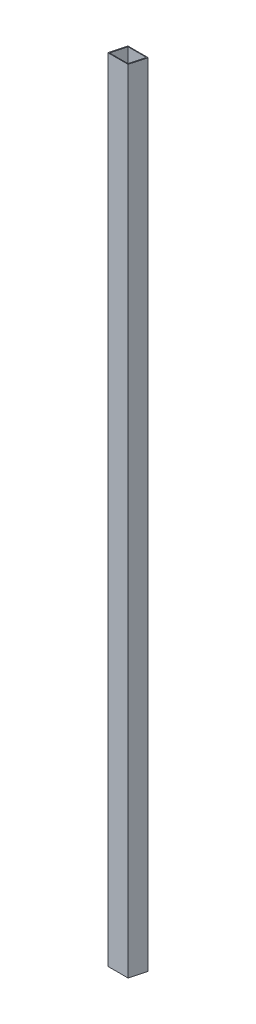
ISO-10303-21;
HEADER;
FILE_DESCRIPTION(('STEP AP214'),'2;1');
FILE_NAME('part.step','',(''),(''),'','','');
FILE_SCHEMA(('AUTOMOTIVE_DESIGN { 1 0 10303 214 1 1 1 1 }'));
ENDSEC;
DATA;
#1=APPLICATION_CONTEXT('core data for automotive mechanical design processes');
#2=APPLICATION_PROTOCOL_DEFINITION('international standard','automotive_design',2000,#1);
#3=PRODUCT_CONTEXT('',#1,'mechanical');
#4=PRODUCT('Part','Part','',(#3));
#5=PRODUCT_RELATED_PRODUCT_CATEGORY('part','',(#4));
#6=PRODUCT_DEFINITION_FORMATION('','',#4);
#7=PRODUCT_DEFINITION_CONTEXT('part definition',#1,'design');
#8=PRODUCT_DEFINITION('design','',#6,#7);
#9=PRODUCT_DEFINITION_SHAPE('','',#8);
#10=(LENGTH_UNIT() NAMED_UNIT(*) SI_UNIT(.MILLI.,.METRE.));
#11=(NAMED_UNIT(*) PLANE_ANGLE_UNIT() SI_UNIT($,.RADIAN.));
#12=(NAMED_UNIT(*) SI_UNIT($,.STERADIAN.) SOLID_ANGLE_UNIT());
#13=UNCERTAINTY_MEASURE_WITH_UNIT(LENGTH_MEASURE(1.E-05),#10,'distance_accuracy_value','');
#14=(GEOMETRIC_REPRESENTATION_CONTEXT(3) GLOBAL_UNCERTAINTY_ASSIGNED_CONTEXT((#13)) GLOBAL_UNIT_ASSIGNED_CONTEXT((#10,
#11,#12)) REPRESENTATION_CONTEXT('',''));
#15=CARTESIAN_POINT('',(0.,0.,0.));
#16=DIRECTION('',(0.,0.,1.));
#17=DIRECTION('',(1.,0.,0.));
#18=AXIS2_PLACEMENT_3D('',#15,#16,#17);
#19=CARTESIAN_POINT('',(-11.5,1200.,-11.5));
#20=DIRECTION('',(0.,0.,1.));
#21=DIRECTION('',(1.,0.,0.));
#22=AXIS2_PLACEMENT_3D('',#19,#20,#21);
#23=PLANE('',#22);
#24=DIRECTION('',(-1.,0.,0.));
#25=VECTOR('',#24,1.);
#26=CARTESIAN_POINT('',(-11.5,0.212556561669963,-11.5));
#27=LINE('',#26,#25);
#28=CARTESIAN_POINT('',(11.5,0.212556561669963,-11.5));
#29=VERTEX_POINT('',#28);
#30=CARTESIAN_POINT('',(-11.5,0.212556561669963,-11.5));
#31=VERTEX_POINT('',#30);
#32=EDGE_CURVE('E11',#29,#31,#27,.T.);
#33=ORIENTED_EDGE('',*,*,#32,.F.);
#34=DIRECTION('',(0.,-1.,0.));
#35=VECTOR('',#34,1.);
#36=CARTESIAN_POINT('',(11.5,1200.,-11.5));
#37=LINE('',#36,#35);
#38=CARTESIAN_POINT('',(11.5,981.659527632097,-11.5));
#39=VERTEX_POINT('',#38);
#40=EDGE_CURVE('E150',#39,#29,#37,.T.);
#41=ORIENTED_EDGE('',*,*,#40,.F.);
#42=DIRECTION('',(1.,0.,0.));
#43=VECTOR('',#42,1.);
#44=CARTESIAN_POINT('',(-11.5,981.659527632097,-11.5));
#45=LINE('',#44,#43);
#46=CARTESIAN_POINT('',(-11.5,981.659527632097,-11.5));
#47=VERTEX_POINT('',#46);
#48=EDGE_CURVE('E47',#47,#39,#45,.T.);
#49=ORIENTED_EDGE('',*,*,#48,.F.);
#50=DIRECTION('',(0.,-1.,0.));
#51=VECTOR('',#50,1.);
#52=CARTESIAN_POINT('',(-11.5,1200.,-11.5));
#53=LINE('',#52,#51);
#54=EDGE_CURVE('E155',#47,#31,#53,.T.);
#55=ORIENTED_EDGE('',*,*,#54,.T.);
#56=EDGE_LOOP('',(#33,#41,#49,#55));
#57=FACE_BOUND('',#56,.T.);
#58=ADVANCED_FACE('F39',(#57),#23,.T.);
#59=CARTESIAN_POINT('',(11.5,1200.,11.5));
#60=DIRECTION('',(-1.,0.,0.));
#61=DIRECTION('',(0.,0.,1.));
#62=AXIS2_PLACEMENT_3D('',#59,#60,#61);
#63=PLANE('',#62);
#64=DIRECTION('',(0.,-0.207911690817754,-0.978147600733807));
#65=VECTOR('',#64,1.);
#66=CARTESIAN_POINT('',(11.5,56.753565131346,254.504531337185));
#67=LINE('',#66,#65);
#68=CARTESIAN_POINT('',(11.5,5.10135748008009,11.5));
#69=VERTEX_POINT('',#68);
#70=EDGE_CURVE('E163',#69,#29,#67,.T.);
#71=ORIENTED_EDGE('',*,*,#70,.F.);
#72=DIRECTION('',(0.,-1.,0.));
#73=VECTOR('',#72,1.);
#74=CARTESIAN_POINT('',(11.5,1200.,11.5));
#75=LINE('',#74,#73);
#76=CARTESIAN_POINT('',(11.5,986.548328550507,11.5));
#77=VERTEX_POINT('',#76);
#78=EDGE_CURVE('E128',#77,#69,#75,.T.);
#79=ORIENTED_EDGE('',*,*,#78,.F.);
#80=DIRECTION('',(0.,0.207911690817754,0.978147600733807));
#81=VECTOR('',#80,1.);
#82=CARTESIAN_POINT('',(11.5,995.775261835801,54.9093081521416));
#83=LINE('',#82,#81);
#84=EDGE_CURVE('E137',#39,#77,#83,.T.);
#85=ORIENTED_EDGE('',*,*,#84,.F.);
#86=ORIENTED_EDGE('',*,*,#40,.T.);
#87=EDGE_LOOP('',(#71,#79,#85,#86));
#88=FACE_BOUND('',#87,.T.);
#89=ADVANCED_FACE('F149',(#88),#63,.T.);
#90=CARTESIAN_POINT('',(-11.5,1200.,11.5));
#91=DIRECTION('',(0.,0.,-1.));
#92=DIRECTION('',(-1.,0.,0.));
#93=AXIS2_PLACEMENT_3D('',#90,#91,#92);
#94=PLANE('',#93);
#95=DIRECTION('',(1.,0.,0.));
#96=VECTOR('',#95,1.);
#97=CARTESIAN_POINT('',(-11.5,5.10135748008023,11.5));
#98=LINE('',#97,#96);
#99=CARTESIAN_POINT('',(-11.5,5.10135748008023,11.5));
#100=VERTEX_POINT('',#99);
#101=EDGE_CURVE('E161',#100,#69,#98,.T.);
#102=ORIENTED_EDGE('',*,*,#101,.F.);
#103=DIRECTION('',(0.,-1.,0.));
#104=VECTOR('',#103,1.);
#105=CARTESIAN_POINT('',(-11.5,1200.,11.5));
#106=LINE('',#105,#104);
#107=CARTESIAN_POINT('',(-11.5,986.548328550507,11.5));
#108=VERTEX_POINT('',#107);
#109=EDGE_CURVE('E123',#108,#100,#106,.T.);
#110=ORIENTED_EDGE('',*,*,#109,.F.);
#111=DIRECTION('',(-1.,0.,0.));
#112=VECTOR('',#111,1.);
#113=CARTESIAN_POINT('',(-11.5,986.548328550507,11.5));
#114=LINE('',#113,#112);
#115=EDGE_CURVE('E152',#77,#108,#114,.T.);
#116=ORIENTED_EDGE('',*,*,#115,.F.);
#117=ORIENTED_EDGE('',*,*,#78,.T.);
#118=EDGE_LOOP('',(#102,#110,#116,#117));
#119=FACE_BOUND('',#118,.T.);
#120=ADVANCED_FACE('F189',(#119),#94,.T.);
#121=CARTESIAN_POINT('',(-11.5,1200.,11.5));
#122=DIRECTION('',(1.,0.,0.));
#123=DIRECTION('',(0.,0.,-1.));
#124=AXIS2_PLACEMENT_3D('',#121,#122,#123);
#125=PLANE('',#124);
#126=DIRECTION('',(0.,0.207911690817754,0.978147600733807));
#127=VECTOR('',#126,1.);
#128=CARTESIAN_POINT('',(-11.5,56.753565131346,254.504531337185));
#129=LINE('',#128,#127);
#130=EDGE_CURVE('E157',#31,#100,#129,.T.);
#131=ORIENTED_EDGE('',*,*,#130,.F.);
#132=ORIENTED_EDGE('',*,*,#54,.F.);
#133=DIRECTION('',(0.,-0.207911690817754,-0.978147600733807));
#134=VECTOR('',#133,1.);
#135=CARTESIAN_POINT('',(-11.5,995.775261835801,54.9093081521416));
#136=LINE('',#135,#134);
#137=EDGE_CURVE('E140',#108,#47,#136,.T.);
#138=ORIENTED_EDGE('',*,*,#137,.F.);
#139=ORIENTED_EDGE('',*,*,#109,.T.);
#140=EDGE_LOOP('',(#131,#132,#138,#139));
#141=FACE_BOUND('',#140,.T.);
#142=ADVANCED_FACE('F181',(#141),#125,.T.);
#143=CARTESIAN_POINT('',(-12.5,986.760885112177,12.5));
#144=DIRECTION('',(0.,-0.978147600733807,0.207911690817754));
#145=DIRECTION('',(0.,-0.207911690817754,-0.978147600733807));
#146=AXIS2_PLACEMENT_3D('',#143,#144,#145);
#147=PLANE('',#146);
#148=ORIENTED_EDGE('',*,*,#137,.T.);
#149=ORIENTED_EDGE('',*,*,#48,.T.);
#150=ORIENTED_EDGE('',*,*,#84,.T.);
#151=ORIENTED_EDGE('',*,*,#115,.T.);
#152=EDGE_LOOP('',(#148,#149,#150,#151));
#153=FACE_BOUND('',#152,.T.);
#154=DIRECTION('',(0.,-0.207911690817754,-0.978147600733807));
#155=VECTOR('',#154,1.);
#156=CARTESIAN_POINT('',(12.5,986.760885112177,12.5));
#157=LINE('',#156,#155);
#158=CARTESIAN_POINT('',(12.5,986.760885112177,12.5));
#159=VERTEX_POINT('',#158);
#160=CARTESIAN_POINT('',(12.5,981.446971070427,-12.5));
#161=VERTEX_POINT('',#160);
#162=EDGE_CURVE('E168',#159,#161,#157,.T.);
#163=ORIENTED_EDGE('',*,*,#162,.T.);
#164=DIRECTION('',(1.,0.,0.));
#165=VECTOR('',#164,1.);
#166=CARTESIAN_POINT('',(-12.5,981.446971070427,-12.5));
#167=LINE('',#166,#165);
#168=CARTESIAN_POINT('',(-12.5,981.446971070427,-12.5));
#169=VERTEX_POINT('',#168);
#170=EDGE_CURVE('E171',#169,#161,#167,.T.);
#171=ORIENTED_EDGE('',*,*,#170,.F.);
#172=DIRECTION('',(0.,-0.207911690817754,-0.978147600733807));
#173=VECTOR('',#172,1.);
#174=CARTESIAN_POINT('',(-12.5,986.760885112177,12.5));
#175=LINE('',#174,#173);
#176=CARTESIAN_POINT('',(-12.5,986.760885112177,12.5));
#177=VERTEX_POINT('',#176);
#178=EDGE_CURVE('E54',#177,#169,#175,.T.);
#179=ORIENTED_EDGE('',*,*,#178,.F.);
#180=DIRECTION('',(1.,0.,0.));
#181=VECTOR('',#180,1.);
#182=CARTESIAN_POINT('',(-12.5,986.760885112177,12.5));
#183=LINE('',#182,#181);
#184=EDGE_CURVE('E169',#177,#159,#183,.T.);
#185=ORIENTED_EDGE('',*,*,#184,.T.);
#186=EDGE_LOOP('',(#163,#171,#179,#185));
#187=FACE_BOUND('',#186,.T.);
#188=ADVANCED_FACE('F136',(#153,#187),#147,.F.);
#189=CARTESIAN_POINT('',(-12.5,0.,-12.5));
#190=DIRECTION('',(0.,0.978147600733807,-0.207911690817754));
#191=DIRECTION('',(0.,0.207911690817754,0.978147600733807));
#192=AXIS2_PLACEMENT_3D('',#189,#190,#191);
#193=PLANE('',#192);
#194=ORIENTED_EDGE('',*,*,#130,.T.);
#195=ORIENTED_EDGE('',*,*,#101,.T.);
#196=ORIENTED_EDGE('',*,*,#70,.T.);
#197=ORIENTED_EDGE('',*,*,#32,.T.);
#198=EDGE_LOOP('',(#194,#195,#196,#197));
#199=FACE_BOUND('',#198,.T.);
#200=DIRECTION('',(0.,0.207911690817754,0.978147600733807));
#201=VECTOR('',#200,1.);
#202=CARTESIAN_POINT('',(12.5,0.,-12.5));
#203=LINE('',#202,#201);
#204=CARTESIAN_POINT('',(12.5,0.,-12.5));
#205=VERTEX_POINT('',#204);
#206=CARTESIAN_POINT('',(12.5,5.31391404175041,12.5));
#207=VERTEX_POINT('',#206);
#208=EDGE_CURVE('E62',#205,#207,#203,.T.);
#209=ORIENTED_EDGE('',*,*,#208,.T.);
#210=DIRECTION('',(1.,0.,0.));
#211=VECTOR('',#210,1.);
#212=CARTESIAN_POINT('',(-12.5,5.31391404175041,12.5));
#213=LINE('',#212,#211);
#214=CARTESIAN_POINT('',(-12.5,5.31391404175041,12.5));
#215=VERTEX_POINT('',#214);
#216=EDGE_CURVE('E106',#215,#207,#213,.T.);
#217=ORIENTED_EDGE('',*,*,#216,.F.);
#218=DIRECTION('',(0.,0.207911690817754,0.978147600733807));
#219=VECTOR('',#218,1.);
#220=CARTESIAN_POINT('',(-12.5,0.,-12.5));
#221=LINE('',#220,#219);
#222=CARTESIAN_POINT('',(-12.5,0.,-12.5));
#223=VERTEX_POINT('',#222);
#224=EDGE_CURVE('E101',#223,#215,#221,.T.);
#225=ORIENTED_EDGE('',*,*,#224,.F.);
#226=DIRECTION('',(-1.,0.,0.));
#227=VECTOR('',#226,1.);
#228=CARTESIAN_POINT('',(-12.5,0.,-12.5));
#229=LINE('',#228,#227);
#230=EDGE_CURVE('E105',#205,#223,#229,.T.);
#231=ORIENTED_EDGE('',*,*,#230,.F.);
#232=EDGE_LOOP('',(#209,#217,#225,#231));
#233=FACE_BOUND('',#232,.T.);
#234=ADVANCED_FACE('F103',(#199,#233),#193,.F.);
#235=CARTESIAN_POINT('',(12.5,1200.,12.5));
#236=DIRECTION('',(-1.,0.,0.));
#237=DIRECTION('',(0.,0.,1.));
#238=AXIS2_PLACEMENT_3D('',#235,#236,#237);
#239=PLANE('',#238);
#240=DIRECTION('',(0.,-1.,0.));
#241=VECTOR('',#240,1.);
#242=CARTESIAN_POINT('',(12.5,1200.,12.5));
#243=LINE('',#242,#241);
#244=EDGE_CURVE('E122',#159,#207,#243,.T.);
#245=ORIENTED_EDGE('',*,*,#244,.T.);
#246=ORIENTED_EDGE('',*,*,#208,.F.);
#247=DIRECTION('',(0.,-1.,0.));
#248=VECTOR('',#247,1.);
#249=CARTESIAN_POINT('',(12.5,1200.,-12.5));
#250=LINE('',#249,#248);
#251=EDGE_CURVE('E116',#161,#205,#250,.T.);
#252=ORIENTED_EDGE('',*,*,#251,.F.);
#253=ORIENTED_EDGE('',*,*,#162,.F.);
#254=EDGE_LOOP('',(#245,#246,#252,#253));
#255=FACE_BOUND('',#254,.T.);
#256=ADVANCED_FACE('F41',(#255),#239,.F.);
#257=CARTESIAN_POINT('',(-12.5,1200.,-12.5));
#258=DIRECTION('',(0.,0.,1.));
#259=DIRECTION('',(1.,0.,0.));
#260=AXIS2_PLACEMENT_3D('',#257,#258,#259);
#261=PLANE('',#260);
#262=DIRECTION('',(0.,-1.,0.));
#263=VECTOR('',#262,1.);
#264=CARTESIAN_POINT('',(-12.5,1200.,-12.5));
#265=LINE('',#264,#263);
#266=EDGE_CURVE('E112',#169,#223,#265,.T.);
#267=ORIENTED_EDGE('',*,*,#266,.F.);
#268=ORIENTED_EDGE('',*,*,#170,.T.);
#269=ORIENTED_EDGE('',*,*,#251,.T.);
#270=ORIENTED_EDGE('',*,*,#230,.T.);
#271=EDGE_LOOP('',(#267,#268,#269,#270));
#272=FACE_BOUND('',#271,.T.);
#273=ADVANCED_FACE('F120',(#272),#261,.F.);
#274=CARTESIAN_POINT('',(-12.5,1200.,12.5));
#275=DIRECTION('',(1.,0.,0.));
#276=DIRECTION('',(0.,0.,-1.));
#277=AXIS2_PLACEMENT_3D('',#274,#275,#276);
#278=PLANE('',#277);
#279=ORIENTED_EDGE('',*,*,#266,.T.);
#280=ORIENTED_EDGE('',*,*,#224,.T.);
#281=DIRECTION('',(0.,-1.,0.));
#282=VECTOR('',#281,1.);
#283=CARTESIAN_POINT('',(-12.5,1200.,12.5));
#284=LINE('',#283,#282);
#285=EDGE_CURVE('E117',#177,#215,#284,.T.);
#286=ORIENTED_EDGE('',*,*,#285,.F.);
#287=ORIENTED_EDGE('',*,*,#178,.T.);
#288=EDGE_LOOP('',(#279,#280,#286,#287));
#289=FACE_BOUND('',#288,.T.);
#290=ADVANCED_FACE('F113',(#289),#278,.F.);
#291=CARTESIAN_POINT('',(-12.5,1200.,12.5));
#292=DIRECTION('',(0.,0.,-1.));
#293=DIRECTION('',(-1.,0.,0.));
#294=AXIS2_PLACEMENT_3D('',#291,#292,#293);
#295=PLANE('',#294);
#296=ORIENTED_EDGE('',*,*,#285,.T.);
#297=ORIENTED_EDGE('',*,*,#216,.T.);
#298=ORIENTED_EDGE('',*,*,#244,.F.);
#299=ORIENTED_EDGE('',*,*,#184,.F.);
#300=EDGE_LOOP('',(#296,#297,#298,#299));
#301=FACE_BOUND('',#300,.T.);
#302=ADVANCED_FACE('F177',(#301),#295,.F.);
#303=CLOSED_SHELL('',(#58,#89,#120,#142,#188,#234,#256,#273,#290,#302));
#304=MANIFOLD_SOLID_BREP('B2',#303);
#305=ADVANCED_BREP_SHAPE_REPRESENTATION('',(#18,#304),#14);
#306=SHAPE_DEFINITION_REPRESENTATION(#9,#305);
ENDSEC;
END-ISO-10303-21;
